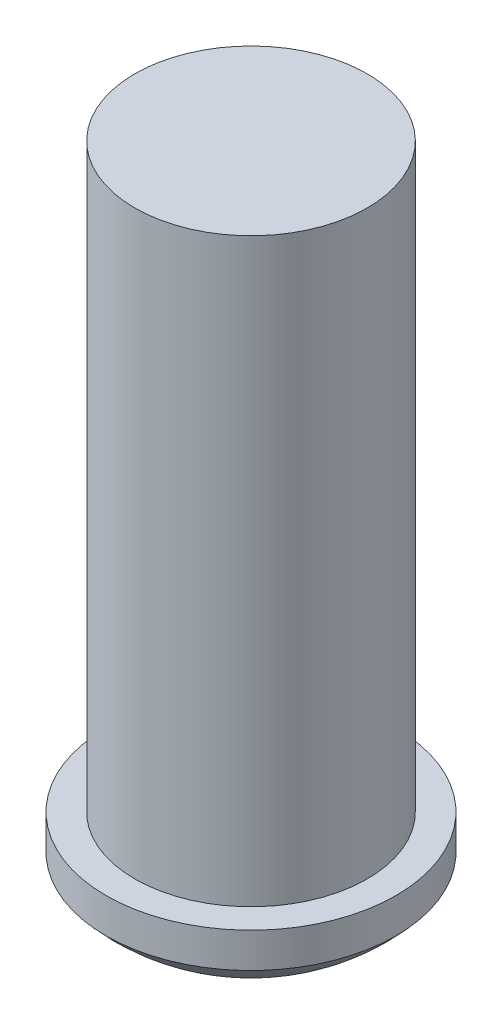
ISO-10303-21;
HEADER;
FILE_DESCRIPTION(('STEP AP214'),'2;1');
FILE_NAME('part.step','',(''),(''),'','','');
FILE_SCHEMA(('AUTOMOTIVE_DESIGN { 1 0 10303 214 1 1 1 1 }'));
ENDSEC;
DATA;
#1=APPLICATION_CONTEXT('core data for automotive mechanical design processes');
#2=APPLICATION_PROTOCOL_DEFINITION('international standard','automotive_design',2000,#1);
#3=PRODUCT_CONTEXT('',#1,'mechanical');
#4=PRODUCT('Part','Part','',(#3));
#5=PRODUCT_RELATED_PRODUCT_CATEGORY('part','',(#4));
#6=PRODUCT_DEFINITION_FORMATION('','',#4);
#7=PRODUCT_DEFINITION_CONTEXT('part definition',#1,'design');
#8=PRODUCT_DEFINITION('design','',#6,#7);
#9=PRODUCT_DEFINITION_SHAPE('','',#8);
#10=(LENGTH_UNIT() NAMED_UNIT(*) SI_UNIT(.MILLI.,.METRE.));
#11=(NAMED_UNIT(*) PLANE_ANGLE_UNIT() SI_UNIT($,.RADIAN.));
#12=(NAMED_UNIT(*) SI_UNIT($,.STERADIAN.) SOLID_ANGLE_UNIT());
#13=UNCERTAINTY_MEASURE_WITH_UNIT(LENGTH_MEASURE(1.E-05),#10,'distance_accuracy_value','');
#14=(GEOMETRIC_REPRESENTATION_CONTEXT(3) GLOBAL_UNCERTAINTY_ASSIGNED_CONTEXT((#13)) GLOBAL_UNIT_ASSIGNED_CONTEXT((#10,
#11,#12)) REPRESENTATION_CONTEXT('',''));
#15=CARTESIAN_POINT('',(0.,0.,0.));
#16=DIRECTION('',(0.,0.,1.));
#17=DIRECTION('',(1.,0.,0.));
#18=AXIS2_PLACEMENT_3D('',#15,#16,#17);
#19=CARTESIAN_POINT('',(0.,5.,0.));
#20=DIRECTION('',(0.,-1.,0.));
#21=DIRECTION('',(0.,0.,-1.));
#22=AXIS2_PLACEMENT_3D('',#19,#20,#21);
#23=CYLINDRICAL_SURFACE('',#22,1.);
#24=CARTESIAN_POINT('',(0.,5.,0.));
#25=DIRECTION('',(0.,1.,0.));
#26=DIRECTION('',(0.,0.,1.));
#27=AXIS2_PLACEMENT_3D('',#24,#25,#26);
#28=CIRCLE('',#27,1.);
#29=CARTESIAN_POINT('',(0.,5.,1.));
#30=VERTEX_POINT('',#29);
#31=EDGE_CURVE('E11',#30,#30,#28,.T.);
#32=ORIENTED_EDGE('',*,*,#31,.F.);
#33=EDGE_LOOP('',(#32));
#34=FACE_BOUND('',#33,.T.);
#35=CARTESIAN_POINT('',(0.,0.,0.));
#36=DIRECTION('',(0.,1.,0.));
#37=DIRECTION('',(0.,0.,1.));
#38=AXIS2_PLACEMENT_3D('',#35,#36,#37);
#39=CIRCLE('',#38,1.);
#40=CARTESIAN_POINT('',(0.,0.,1.));
#41=VERTEX_POINT('',#40);
#42=EDGE_CURVE('E36',#41,#41,#39,.T.);
#43=ORIENTED_EDGE('',*,*,#42,.T.);
#44=EDGE_LOOP('',(#43));
#45=FACE_BOUND('',#44,.T.);
#46=ADVANCED_FACE('F33',(#34,#45),#23,.T.);
#47=CARTESIAN_POINT('',(0.,5.,0.));
#48=DIRECTION('',(0.,1.,0.));
#49=DIRECTION('',(0.,0.,1.));
#50=AXIS2_PLACEMENT_3D('',#47,#48,#49);
#51=PLANE('',#50);
#52=ORIENTED_EDGE('',*,*,#31,.T.);
#53=EDGE_LOOP('',(#52));
#54=FACE_BOUND('',#53,.T.);
#55=ADVANCED_FACE('F67',(#54),#51,.T.);
#56=CARTESIAN_POINT('',(0.,0.,0.));
#57=DIRECTION('',(0.,1.,0.));
#58=DIRECTION('',(0.,0.,1.));
#59=AXIS2_PLACEMENT_3D('',#56,#57,#58);
#60=PLANE('',#59);
#61=ORIENTED_EDGE('',*,*,#42,.F.);
#62=EDGE_LOOP('',(#61));
#63=FACE_BOUND('',#62,.T.);
#64=CARTESIAN_POINT('',(0.,0.,0.));
#65=DIRECTION('',(0.,1.,0.));
#66=DIRECTION('',(0.,0.,1.));
#67=AXIS2_PLACEMENT_3D('',#64,#65,#66);
#68=CIRCLE('',#67,1.24718499663449);
#69=CARTESIAN_POINT('',(0.,0.,1.24718499663449));
#70=VERTEX_POINT('',#69);
#71=EDGE_CURVE('E51',#70,#70,#68,.T.);
#72=ORIENTED_EDGE('',*,*,#71,.T.);
#73=EDGE_LOOP('',(#72));
#74=FACE_BOUND('',#73,.T.);
#75=ADVANCED_FACE('F65',(#63,#74),#60,.T.);
#76=CARTESIAN_POINT('',(0.,0.,0.));
#77=DIRECTION('',(0.,1.,0.));
#78=DIRECTION('',(0.,0.,1.));
#79=AXIS2_PLACEMENT_3D('',#76,#77,#78);
#80=CYLINDRICAL_SURFACE('',#79,1.24718499663449);
#81=CARTESIAN_POINT('',(0.,-0.300388250673696,0.));
#82=DIRECTION('',(0.,1.,0.));
#83=DIRECTION('',(0.,0.,1.));
#84=AXIS2_PLACEMENT_3D('',#81,#82,#83);
#85=CIRCLE('',#84,1.24718499663449);
#86=CARTESIAN_POINT('',(0.,-0.300388250673696,1.24718499663449));
#87=VERTEX_POINT('',#86);
#88=EDGE_CURVE('E49',#87,#87,#85,.T.);
#89=ORIENTED_EDGE('',*,*,#88,.T.);
#90=EDGE_LOOP('',(#89));
#91=FACE_BOUND('',#90,.T.);
#92=ORIENTED_EDGE('',*,*,#71,.F.);
#93=EDGE_LOOP('',(#92));
#94=FACE_BOUND('',#93,.T.);
#95=ADVANCED_FACE('F45',(#91,#94),#80,.T.);
#96=CARTESIAN_POINT('',(-1.24718499663449,-0.300388250673696,0.));
#97=CARTESIAN_POINT('',(-0.759268596101439,-0.856933586556088,0.));
#98=CARTESIAN_POINT('',(0.,-0.803737914721309,0.));
#99=B_SPLINE_CURVE_WITH_KNOTS('',2,(#96,#97,#98),.UNSPECIFIED.,.F.,.F.,(3,3),(0.,1.),.UNSPECIFIED.);
#100=CARTESIAN_POINT('',(0.,0.,0.));
#101=DIRECTION('',(0.,1.,0.));
#102=AXIS1_PLACEMENT('',#100,#101);
#103=SURFACE_OF_REVOLUTION('',#99,#102);
#104=CARTESIAN_POINT('',(0.,-0.803737914721309,0.));
#105=VERTEX_POINT('',#104);
#106=VERTEX_LOOP('',#105);
#107=FACE_BOUND('',#106,.T.);
#108=ORIENTED_EDGE('',*,*,#88,.F.);
#109=EDGE_LOOP('',(#108));
#110=FACE_BOUND('',#109,.T.);
#111=ADVANCED_FACE('F42',(#107,#110),#103,.F.);
#112=CLOSED_SHELL('',(#46,#55,#75,#95,#111));
#113=MANIFOLD_SOLID_BREP('B2',#112);
#114=ADVANCED_BREP_SHAPE_REPRESENTATION('',(#18,#113),#14);
#115=SHAPE_DEFINITION_REPRESENTATION(#9,#114);
ENDSEC;
END-ISO-10303-21;
